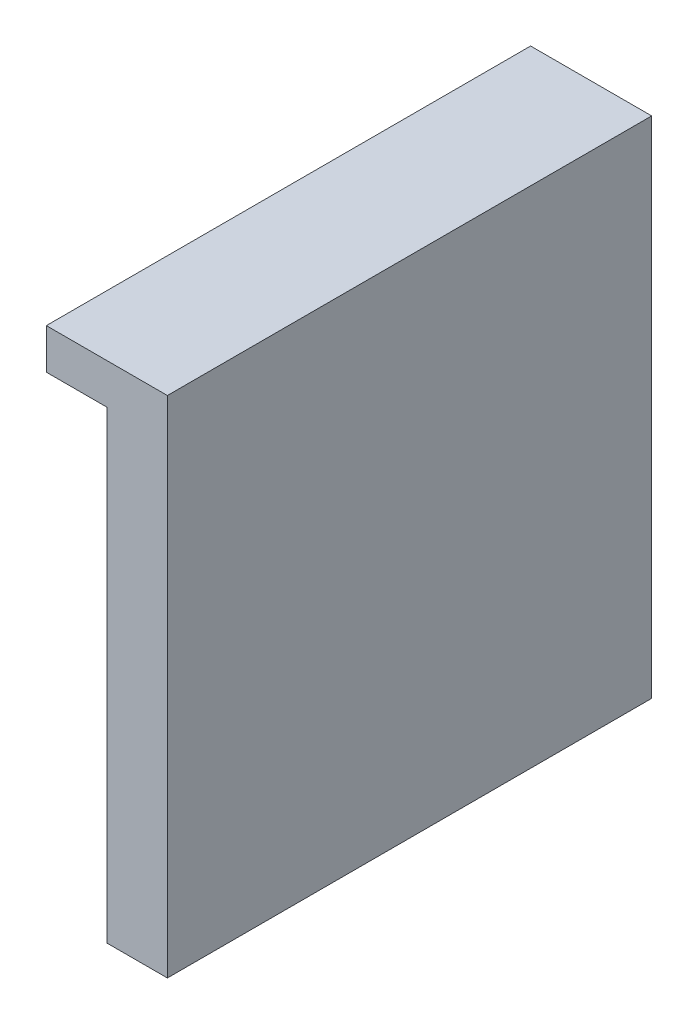
ISO-10303-21;
HEADER;
FILE_DESCRIPTION(('STEP AP214'),'2;1');
FILE_NAME('part.step','',(''),(''),'','','');
FILE_SCHEMA(('AUTOMOTIVE_DESIGN { 1 0 10303 214 1 1 1 1 }'));
ENDSEC;
DATA;
#1=APPLICATION_CONTEXT('core data for automotive mechanical design processes');
#2=APPLICATION_PROTOCOL_DEFINITION('international standard','automotive_design',2000,#1);
#3=PRODUCT_CONTEXT('',#1,'mechanical');
#4=PRODUCT('Part','Part','',(#3));
#5=PRODUCT_RELATED_PRODUCT_CATEGORY('part','',(#4));
#6=PRODUCT_DEFINITION_FORMATION('','',#4);
#7=PRODUCT_DEFINITION_CONTEXT('part definition',#1,'design');
#8=PRODUCT_DEFINITION('design','',#6,#7);
#9=PRODUCT_DEFINITION_SHAPE('','',#8);
#10=(LENGTH_UNIT() NAMED_UNIT(*) SI_UNIT(.MILLI.,.METRE.));
#11=(NAMED_UNIT(*) PLANE_ANGLE_UNIT() SI_UNIT($,.RADIAN.));
#12=(NAMED_UNIT(*) SI_UNIT($,.STERADIAN.) SOLID_ANGLE_UNIT());
#13=UNCERTAINTY_MEASURE_WITH_UNIT(LENGTH_MEASURE(1.E-05),#10,'distance_accuracy_value','');
#14=(GEOMETRIC_REPRESENTATION_CONTEXT(3) GLOBAL_UNCERTAINTY_ASSIGNED_CONTEXT((#13)) GLOBAL_UNIT_ASSIGNED_CONTEXT((#10,
#11,#12)) REPRESENTATION_CONTEXT('',''));
#15=CARTESIAN_POINT('',(0.,0.,0.));
#16=DIRECTION('',(0.,0.,1.));
#17=DIRECTION('',(1.,0.,0.));
#18=AXIS2_PLACEMENT_3D('',#15,#16,#17);
#19=CARTESIAN_POINT('',(0.,23.,-24.));
#20=DIRECTION('',(0.,0.,-1.));
#21=DIRECTION('',(-1.,0.,0.));
#22=AXIS2_PLACEMENT_3D('',#19,#20,#21);
#23=PLANE('',#22);
#24=DIRECTION('',(1.,0.,0.));
#25=VECTOR('',#24,1.);
#26=CARTESIAN_POINT('',(0.,0.,-24.));
#27=LINE('',#26,#25);
#28=CARTESIAN_POINT('',(0.,0.,-24.));
#29=VERTEX_POINT('',#28);
#30=CARTESIAN_POINT('',(3.,0.,-24.));
#31=VERTEX_POINT('',#30);
#32=EDGE_CURVE('E120',#29,#31,#27,.T.);
#33=ORIENTED_EDGE('',*,*,#32,.F.);
#34=DIRECTION('',(0.,-1.,0.));
#35=VECTOR('',#34,1.);
#36=CARTESIAN_POINT('',(0.,23.,-24.));
#37=LINE('',#36,#35);
#38=CARTESIAN_POINT('',(0.,23.,-24.));
#39=VERTEX_POINT('',#38);
#40=EDGE_CURVE('E11',#39,#29,#37,.T.);
#41=ORIENTED_EDGE('',*,*,#40,.F.);
#42=DIRECTION('',(-1.,0.,0.));
#43=VECTOR('',#42,1.);
#44=CARTESIAN_POINT('',(3.,23.,-24.));
#45=LINE('',#44,#43);
#46=CARTESIAN_POINT('',(-3.,23.,-24.));
#47=VERTEX_POINT('',#46);
#48=EDGE_CURVE('E70',#39,#47,#45,.T.);
#49=ORIENTED_EDGE('',*,*,#48,.T.);
#50=DIRECTION('',(0.,-1.,0.));
#51=VECTOR('',#50,1.);
#52=CARTESIAN_POINT('',(-3.,25.,-24.));
#53=LINE('',#52,#51);
#54=CARTESIAN_POINT('',(-3.,25.,-24.));
#55=VERTEX_POINT('',#54);
#56=EDGE_CURVE('E127',#55,#47,#53,.T.);
#57=ORIENTED_EDGE('',*,*,#56,.F.);
#58=DIRECTION('',(-1.,0.,0.));
#59=VECTOR('',#58,1.);
#60=CARTESIAN_POINT('',(3.,25.,-24.));
#61=LINE('',#60,#59);
#62=CARTESIAN_POINT('',(3.,25.,-24.));
#63=VERTEX_POINT('',#62);
#64=EDGE_CURVE('E124',#63,#55,#61,.T.);
#65=ORIENTED_EDGE('',*,*,#64,.F.);
#66=DIRECTION('',(0.,-1.,0.));
#67=VECTOR('',#66,1.);
#68=CARTESIAN_POINT('',(3.,23.,-24.));
#69=LINE('',#68,#67);
#70=EDGE_CURVE('E48',#63,#31,#69,.T.);
#71=ORIENTED_EDGE('',*,*,#70,.T.);
#72=EDGE_LOOP('',(#33,#41,#49,#57,#65,#71));
#73=FACE_BOUND('',#72,.T.);
#74=ADVANCED_FACE('F45',(#73),#23,.T.);
#75=CARTESIAN_POINT('',(0.,23.,0.));
#76=DIRECTION('',(-1.,0.,0.));
#77=DIRECTION('',(0.,0.,1.));
#78=AXIS2_PLACEMENT_3D('',#75,#76,#77);
#79=PLANE('',#78);
#80=DIRECTION('',(0.,-1.,0.));
#81=VECTOR('',#80,1.);
#82=CARTESIAN_POINT('',(0.,12.,-23.));
#83=LINE('',#82,#81);
#84=CARTESIAN_POINT('',(0.,21.,-23.));
#85=VERTEX_POINT('',#84);
#86=CARTESIAN_POINT('',(0.,12.,-23.));
#87=VERTEX_POINT('',#86);
#88=EDGE_CURVE('E61',#85,#87,#83,.T.);
#89=ORIENTED_EDGE('',*,*,#88,.F.);
#90=DIRECTION('',(0.,0.,-1.));
#91=VECTOR('',#90,1.);
#92=CARTESIAN_POINT('',(0.,21.,-23.));
#93=LINE('',#92,#91);
#94=CARTESIAN_POINT('',(0.,21.,-1.));
#95=VERTEX_POINT('',#94);
#96=EDGE_CURVE('E158',#95,#85,#93,.T.);
#97=ORIENTED_EDGE('',*,*,#96,.F.);
#98=DIRECTION('',(0.,1.,0.));
#99=VECTOR('',#98,1.);
#100=CARTESIAN_POINT('',(0.,12.,-1.));
#101=LINE('',#100,#99);
#102=CARTESIAN_POINT('',(0.,12.,-1.));
#103=VERTEX_POINT('',#102);
#104=EDGE_CURVE('E162',#103,#95,#101,.T.);
#105=ORIENTED_EDGE('',*,*,#104,.F.);
#106=DIRECTION('',(0.,0.,1.));
#107=VECTOR('',#106,1.);
#108=CARTESIAN_POINT('',(0.,12.,-23.));
#109=LINE('',#108,#107);
#110=EDGE_CURVE('E165',#87,#103,#109,.T.);
#111=ORIENTED_EDGE('',*,*,#110,.F.);
#112=EDGE_LOOP('',(#89,#97,#105,#111));
#113=FACE_BOUND('',#112,.T.);
#114=DIRECTION('',(0.,0.,-1.));
#115=VECTOR('',#114,1.);
#116=CARTESIAN_POINT('',(0.,0.,0.));
#117=LINE('',#116,#115);
#118=CARTESIAN_POINT('',(0.,0.,0.));
#119=VERTEX_POINT('',#118);
#120=EDGE_CURVE('E105',#119,#29,#117,.T.);
#121=ORIENTED_EDGE('',*,*,#120,.F.);
#122=DIRECTION('',(0.,-1.,0.));
#123=VECTOR('',#122,1.);
#124=CARTESIAN_POINT('',(0.,23.,0.));
#125=LINE('',#124,#123);
#126=CARTESIAN_POINT('',(0.,23.,0.));
#127=VERTEX_POINT('',#126);
#128=EDGE_CURVE('E53',#127,#119,#125,.T.);
#129=ORIENTED_EDGE('',*,*,#128,.F.);
#130=DIRECTION('',(0.,0.,-1.));
#131=VECTOR('',#130,1.);
#132=CARTESIAN_POINT('',(0.,23.,0.));
#133=LINE('',#132,#131);
#134=EDGE_CURVE('E111',#127,#39,#133,.T.);
#135=ORIENTED_EDGE('',*,*,#134,.T.);
#136=ORIENTED_EDGE('',*,*,#40,.T.);
#137=EDGE_LOOP('',(#121,#129,#135,#136));
#138=FACE_BOUND('',#137,.T.);
#139=ADVANCED_FACE('F109',(#113,#138),#79,.T.);
#140=CARTESIAN_POINT('',(0.,23.,0.));
#141=DIRECTION('',(0.,0.,-1.));
#142=DIRECTION('',(-1.,0.,0.));
#143=AXIS2_PLACEMENT_3D('',#140,#141,#142);
#144=PLANE('',#143);
#145=DIRECTION('',(1.,0.,0.));
#146=VECTOR('',#145,1.);
#147=CARTESIAN_POINT('',(0.,0.,0.));
#148=LINE('',#147,#146);
#149=CARTESIAN_POINT('',(3.,0.,0.));
#150=VERTEX_POINT('',#149);
#151=EDGE_CURVE('E90',#119,#150,#148,.T.);
#152=ORIENTED_EDGE('',*,*,#151,.T.);
#153=DIRECTION('',(0.,-1.,0.));
#154=VECTOR('',#153,1.);
#155=CARTESIAN_POINT('',(3.,23.,0.));
#156=LINE('',#155,#154);
#157=CARTESIAN_POINT('',(3.,25.,0.));
#158=VERTEX_POINT('',#157);
#159=EDGE_CURVE('E98',#158,#150,#156,.T.);
#160=ORIENTED_EDGE('',*,*,#159,.F.);
#161=DIRECTION('',(-1.,0.,0.));
#162=VECTOR('',#161,1.);
#163=CARTESIAN_POINT('',(3.,25.,0.));
#164=LINE('',#163,#162);
#165=CARTESIAN_POINT('',(-3.,25.,0.));
#166=VERTEX_POINT('',#165);
#167=EDGE_CURVE('E141',#158,#166,#164,.T.);
#168=ORIENTED_EDGE('',*,*,#167,.T.);
#169=DIRECTION('',(0.,-1.,0.));
#170=VECTOR('',#169,1.);
#171=CARTESIAN_POINT('',(-3.,25.,0.));
#172=LINE('',#171,#170);
#173=CARTESIAN_POINT('',(-3.,23.,0.));
#174=VERTEX_POINT('',#173);
#175=EDGE_CURVE('E130',#166,#174,#172,.T.);
#176=ORIENTED_EDGE('',*,*,#175,.T.);
#177=DIRECTION('',(-1.,0.,0.));
#178=VECTOR('',#177,1.);
#179=CARTESIAN_POINT('',(3.,23.,0.));
#180=LINE('',#179,#178);
#181=EDGE_CURVE('E94',#127,#174,#180,.T.);
#182=ORIENTED_EDGE('',*,*,#181,.F.);
#183=ORIENTED_EDGE('',*,*,#128,.T.);
#184=EDGE_LOOP('',(#152,#160,#168,#176,#182,#183));
#185=FACE_BOUND('',#184,.T.);
#186=ADVANCED_FACE('F88',(#185),#144,.F.);
#187=CARTESIAN_POINT('',(3.,23.,0.));
#188=DIRECTION('',(-1.,0.,0.));
#189=DIRECTION('',(0.,0.,1.));
#190=AXIS2_PLACEMENT_3D('',#187,#188,#189);
#191=PLANE('',#190);
#192=DIRECTION('',(0.,0.,-1.));
#193=VECTOR('',#192,1.);
#194=CARTESIAN_POINT('',(3.,0.,0.));
#195=LINE('',#194,#193);
#196=EDGE_CURVE('E107',#150,#31,#195,.T.);
#197=ORIENTED_EDGE('',*,*,#196,.T.);
#198=ORIENTED_EDGE('',*,*,#70,.F.);
#199=DIRECTION('',(0.,0.,-1.));
#200=VECTOR('',#199,1.);
#201=CARTESIAN_POINT('',(3.,25.,0.));
#202=LINE('',#201,#200);
#203=EDGE_CURVE('E134',#158,#63,#202,.T.);
#204=ORIENTED_EDGE('',*,*,#203,.F.);
#205=ORIENTED_EDGE('',*,*,#159,.T.);
#206=EDGE_LOOP('',(#197,#198,#204,#205));
#207=FACE_BOUND('',#206,.T.);
#208=ADVANCED_FACE('F126',(#207),#191,.F.);
#209=CARTESIAN_POINT('',(0.,0.,0.));
#210=DIRECTION('',(0.,1.,0.));
#211=DIRECTION('',(0.,0.,1.));
#212=AXIS2_PLACEMENT_3D('',#209,#210,#211);
#213=PLANE('',#212);
#214=ORIENTED_EDGE('',*,*,#32,.T.);
#215=ORIENTED_EDGE('',*,*,#196,.F.);
#216=ORIENTED_EDGE('',*,*,#151,.F.);
#217=ORIENTED_EDGE('',*,*,#120,.T.);
#218=EDGE_LOOP('',(#214,#215,#216,#217));
#219=FACE_BOUND('',#218,.T.);
#220=ADVANCED_FACE('F104',(#219),#213,.F.);
#221=CARTESIAN_POINT('',(0.,23.,0.));
#222=DIRECTION('',(0.,-1.,0.));
#223=DIRECTION('',(0.,0.,-1.));
#224=AXIS2_PLACEMENT_3D('',#221,#222,#223);
#225=PLANE('',#224);
#226=ORIENTED_EDGE('',*,*,#134,.F.);
#227=ORIENTED_EDGE('',*,*,#181,.T.);
#228=DIRECTION('',(0.,0.,-1.));
#229=VECTOR('',#228,1.);
#230=CARTESIAN_POINT('',(-3.,23.,0.));
#231=LINE('',#230,#229);
#232=EDGE_CURVE('E136',#174,#47,#231,.T.);
#233=ORIENTED_EDGE('',*,*,#232,.T.);
#234=ORIENTED_EDGE('',*,*,#48,.F.);
#235=EDGE_LOOP('',(#226,#227,#233,#234));
#236=FACE_BOUND('',#235,.T.);
#237=ADVANCED_FACE('F212',(#236),#225,.T.);
#238=CARTESIAN_POINT('',(-3.,25.,0.));
#239=DIRECTION('',(-1.,0.,0.));
#240=DIRECTION('',(0.,0.,1.));
#241=AXIS2_PLACEMENT_3D('',#238,#239,#240);
#242=PLANE('',#241);
#243=ORIENTED_EDGE('',*,*,#232,.F.);
#244=ORIENTED_EDGE('',*,*,#175,.F.);
#245=DIRECTION('',(0.,0.,-1.));
#246=VECTOR('',#245,1.);
#247=CARTESIAN_POINT('',(-3.,25.,0.));
#248=LINE('',#247,#246);
#249=EDGE_CURVE('E144',#166,#55,#248,.T.);
#250=ORIENTED_EDGE('',*,*,#249,.T.);
#251=ORIENTED_EDGE('',*,*,#56,.T.);
#252=EDGE_LOOP('',(#243,#244,#250,#251));
#253=FACE_BOUND('',#252,.T.);
#254=ADVANCED_FACE('F217',(#253),#242,.T.);
#255=CARTESIAN_POINT('',(0.,25.,0.));
#256=DIRECTION('',(0.,-1.,0.));
#257=DIRECTION('',(0.,0.,-1.));
#258=AXIS2_PLACEMENT_3D('',#255,#256,#257);
#259=PLANE('',#258);
#260=ORIENTED_EDGE('',*,*,#64,.T.);
#261=ORIENTED_EDGE('',*,*,#249,.F.);
#262=ORIENTED_EDGE('',*,*,#167,.F.);
#263=ORIENTED_EDGE('',*,*,#203,.T.);
#264=EDGE_LOOP('',(#260,#261,#262,#263));
#265=FACE_BOUND('',#264,.T.);
#266=ADVANCED_FACE('F219',(#265),#259,.F.);
#267=CARTESIAN_POINT('',(0.999999999999995,12.,-23.));
#268=DIRECTION('',(0.,0.,-1.));
#269=DIRECTION('',(-1.,0.,0.));
#270=AXIS2_PLACEMENT_3D('',#267,#268,#269);
#271=PLANE('',#270);
#272=ORIENTED_EDGE('',*,*,#88,.T.);
#273=DIRECTION('',(-1.,0.,0.));
#274=VECTOR('',#273,1.);
#275=CARTESIAN_POINT('',(0.999999999999995,12.,-23.));
#276=LINE('',#275,#274);
#277=CARTESIAN_POINT('',(0.999999999999995,12.,-23.));
#278=VERTEX_POINT('',#277);
#279=EDGE_CURVE('E148',#278,#87,#276,.T.);
#280=ORIENTED_EDGE('',*,*,#279,.F.);
#281=DIRECTION('',(0.,-1.,0.));
#282=VECTOR('',#281,1.);
#283=CARTESIAN_POINT('',(0.999999999999995,12.,-23.));
#284=LINE('',#283,#282);
#285=CARTESIAN_POINT('',(0.999999999999995,21.,-23.));
#286=VERTEX_POINT('',#285);
#287=EDGE_CURVE('E161',#286,#278,#284,.T.);
#288=ORIENTED_EDGE('',*,*,#287,.F.);
#289=DIRECTION('',(-1.,0.,0.));
#290=VECTOR('',#289,1.);
#291=CARTESIAN_POINT('',(0.999999999999995,21.,-23.));
#292=LINE('',#291,#290);
#293=EDGE_CURVE('E139',#286,#85,#292,.T.);
#294=ORIENTED_EDGE('',*,*,#293,.T.);
#295=EDGE_LOOP('',(#272,#280,#288,#294));
#296=FACE_BOUND('',#295,.T.);
#297=ADVANCED_FACE('F188',(#296),#271,.F.);
#298=CARTESIAN_POINT('',(0.999999999999995,21.,-23.));
#299=DIRECTION('',(0.,1.,0.));
#300=DIRECTION('',(0.,0.,1.));
#301=AXIS2_PLACEMENT_3D('',#298,#299,#300);
#302=PLANE('',#301);
#303=ORIENTED_EDGE('',*,*,#96,.T.);
#304=ORIENTED_EDGE('',*,*,#293,.F.);
#305=DIRECTION('',(0.,0.,-1.));
#306=VECTOR('',#305,1.);
#307=CARTESIAN_POINT('',(0.999999999999995,21.,-23.));
#308=LINE('',#307,#306);
#309=CARTESIAN_POINT('',(1.,21.,-1.));
#310=VERTEX_POINT('',#309);
#311=EDGE_CURVE('E151',#310,#286,#308,.T.);
#312=ORIENTED_EDGE('',*,*,#311,.F.);
#313=DIRECTION('',(-1.,0.,0.));
#314=VECTOR('',#313,1.);
#315=CARTESIAN_POINT('',(1.,21.,-1.));
#316=LINE('',#315,#314);
#317=EDGE_CURVE('E154',#310,#95,#316,.T.);
#318=ORIENTED_EDGE('',*,*,#317,.T.);
#319=EDGE_LOOP('',(#303,#304,#312,#318));
#320=FACE_BOUND('',#319,.T.);
#321=ADVANCED_FACE('F227',(#320),#302,.F.);
#322=CARTESIAN_POINT('',(1.,12.,-1.));
#323=DIRECTION('',(0.,0.,1.));
#324=DIRECTION('',(1.,0.,0.));
#325=AXIS2_PLACEMENT_3D('',#322,#323,#324);
#326=PLANE('',#325);
#327=ORIENTED_EDGE('',*,*,#104,.T.);
#328=ORIENTED_EDGE('',*,*,#317,.F.);
#329=DIRECTION('',(0.,1.,0.));
#330=VECTOR('',#329,1.);
#331=CARTESIAN_POINT('',(1.,12.,-1.));
#332=LINE('',#331,#330);
#333=CARTESIAN_POINT('',(1.,12.,-1.));
#334=VERTEX_POINT('',#333);
#335=EDGE_CURVE('E171',#334,#310,#332,.T.);
#336=ORIENTED_EDGE('',*,*,#335,.F.);
#337=DIRECTION('',(-1.,0.,0.));
#338=VECTOR('',#337,1.);
#339=CARTESIAN_POINT('',(1.,12.,-1.));
#340=LINE('',#339,#338);
#341=EDGE_CURVE('E150',#334,#103,#340,.T.);
#342=ORIENTED_EDGE('',*,*,#341,.T.);
#343=EDGE_LOOP('',(#327,#328,#336,#342));
#344=FACE_BOUND('',#343,.T.);
#345=ADVANCED_FACE('F275',(#344),#326,.F.);
#346=CARTESIAN_POINT('',(0.999999999999995,12.,-23.));
#347=DIRECTION('',(0.,-1.,0.));
#348=DIRECTION('',(0.,0.,-1.));
#349=AXIS2_PLACEMENT_3D('',#346,#347,#348);
#350=PLANE('',#349);
#351=ORIENTED_EDGE('',*,*,#110,.T.);
#352=ORIENTED_EDGE('',*,*,#341,.F.);
#353=DIRECTION('',(0.,0.,1.));
#354=VECTOR('',#353,1.);
#355=CARTESIAN_POINT('',(0.999999999999995,12.,-23.));
#356=LINE('',#355,#354);
#357=EDGE_CURVE('E174',#278,#334,#356,.T.);
#358=ORIENTED_EDGE('',*,*,#357,.F.);
#359=ORIENTED_EDGE('',*,*,#279,.T.);
#360=EDGE_LOOP('',(#351,#352,#358,#359));
#361=FACE_BOUND('',#360,.T.);
#362=ADVANCED_FACE('F284',(#361),#350,.F.);
#363=CARTESIAN_POINT('',(1.,0.,0.));
#364=DIRECTION('',(1.,0.,0.));
#365=DIRECTION('',(0.,0.,-1.));
#366=AXIS2_PLACEMENT_3D('',#363,#364,#365);
#367=PLANE('',#366);
#368=ORIENTED_EDGE('',*,*,#287,.T.);
#369=ORIENTED_EDGE('',*,*,#357,.T.);
#370=ORIENTED_EDGE('',*,*,#335,.T.);
#371=ORIENTED_EDGE('',*,*,#311,.T.);
#372=EDGE_LOOP('',(#368,#369,#370,#371));
#373=FACE_BOUND('',#372,.T.);
#374=ADVANCED_FACE('F181',(#373),#367,.F.);
#375=CLOSED_SHELL('',(#74,#139,#186,#208,#220,#237,#254,#266,#297,#321,#345,#362,#374));
#376=MANIFOLD_SOLID_BREP('B2',#375);
#377=ADVANCED_BREP_SHAPE_REPRESENTATION('',(#18,#376),#14);
#378=SHAPE_DEFINITION_REPRESENTATION(#9,#377);
ENDSEC;
END-ISO-10303-21;
